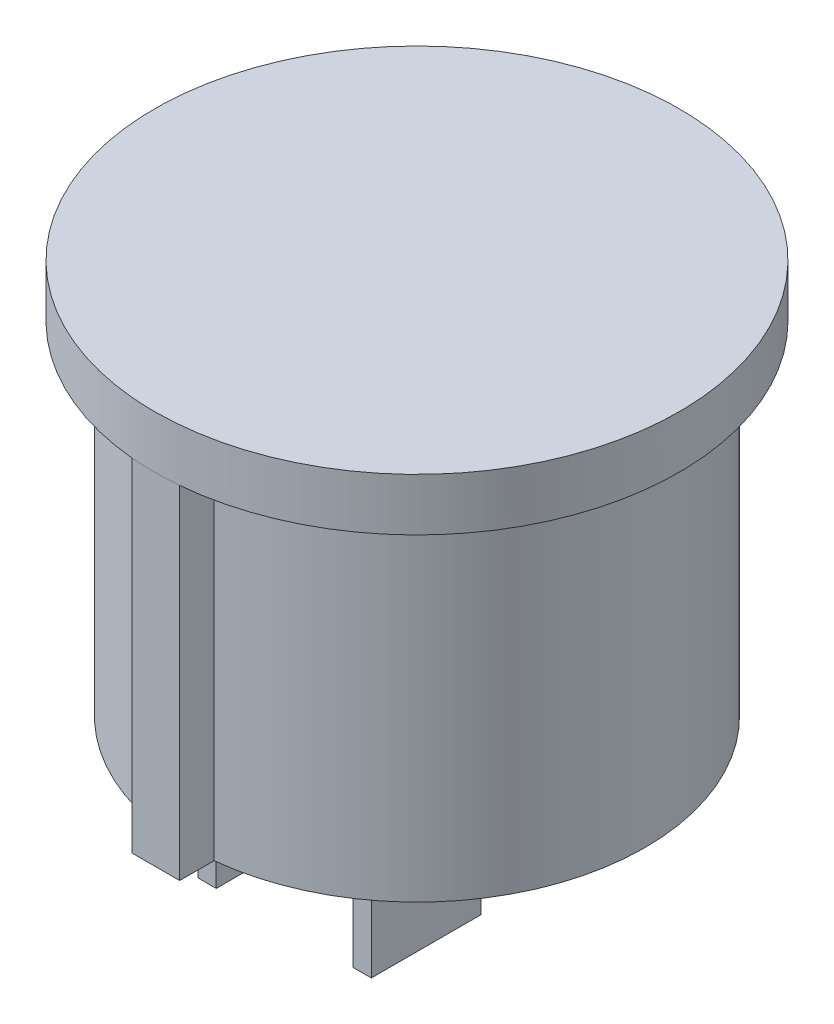
ISO-10303-21;
HEADER;
FILE_DESCRIPTION(('STEP AP214'),'2;1');
FILE_NAME('part.step','',(''),(''),'','','');
FILE_SCHEMA(('AUTOMOTIVE_DESIGN { 1 0 10303 214 1 1 1 1 }'));
ENDSEC;
DATA;
#1=APPLICATION_CONTEXT('core data for automotive mechanical design processes');
#2=APPLICATION_PROTOCOL_DEFINITION('international standard','automotive_design',2000,#1);
#3=PRODUCT_CONTEXT('',#1,'mechanical');
#4=PRODUCT('Part','Part','',(#3));
#5=PRODUCT_RELATED_PRODUCT_CATEGORY('part','',(#4));
#6=PRODUCT_DEFINITION_FORMATION('','',#4);
#7=PRODUCT_DEFINITION_CONTEXT('part definition',#1,'design');
#8=PRODUCT_DEFINITION('design','',#6,#7);
#9=PRODUCT_DEFINITION_SHAPE('','',#8);
#10=(LENGTH_UNIT() NAMED_UNIT(*) SI_UNIT(.MILLI.,.METRE.));
#11=(NAMED_UNIT(*) PLANE_ANGLE_UNIT() SI_UNIT($,.RADIAN.));
#12=(NAMED_UNIT(*) SI_UNIT($,.STERADIAN.) SOLID_ANGLE_UNIT());
#13=UNCERTAINTY_MEASURE_WITH_UNIT(LENGTH_MEASURE(1.E-05),#10,'distance_accuracy_value','');
#14=(GEOMETRIC_REPRESENTATION_CONTEXT(3) GLOBAL_UNCERTAINTY_ASSIGNED_CONTEXT((#13)) GLOBAL_UNIT_ASSIGNED_CONTEXT((#10,
#11,#12)) REPRESENTATION_CONTEXT('',''));
#15=CARTESIAN_POINT('',(0.,0.,0.));
#16=DIRECTION('',(0.,0.,1.));
#17=DIRECTION('',(1.,0.,0.));
#18=AXIS2_PLACEMENT_3D('',#15,#16,#17);
#19=CARTESIAN_POINT('',(0.,15.,0.));
#20=DIRECTION('',(0.,1.,0.));
#21=DIRECTION('',(0.,0.,1.));
#22=AXIS2_PLACEMENT_3D('',#19,#20,#21);
#23=PLANE('',#22);
#24=CARTESIAN_POINT('',(0.,15.,0.));
#25=DIRECTION('',(0.,1.,0.));
#26=DIRECTION('',(0.,0.,1.));
#27=AXIS2_PLACEMENT_3D('',#24,#25,#26);
#28=CIRCLE('',#27,11.5);
#29=CARTESIAN_POINT('',(1.05,15.,11.4519648969074));
#30=VERTEX_POINT('',#29);
#31=CARTESIAN_POINT('',(-1.05,15.,11.4519648969074));
#32=VERTEX_POINT('',#31);
#33=EDGE_CURVE('E150',#30,#32,#28,.T.);
#34=ORIENTED_EDGE('',*,*,#33,.F.);
#35=DIRECTION('',(0.,0.,1.));
#36=VECTOR('',#35,1.);
#37=CARTESIAN_POINT('',(1.05,15.,9.94472221834275));
#38=LINE('',#37,#36);
#39=CARTESIAN_POINT('',(1.05,15.,9.94472221834275));
#40=VERTEX_POINT('',#39);
#41=EDGE_CURVE('E129',#40,#30,#38,.T.);
#42=ORIENTED_EDGE('',*,*,#41,.F.);
#43=CARTESIAN_POINT('',(0.,15.,0.));
#44=DIRECTION('',(0.,1.,0.));
#45=DIRECTION('',(0.,0.,1.));
#46=AXIS2_PLACEMENT_3D('',#43,#44,#45);
#47=CIRCLE('',#46,10.);
#48=CARTESIAN_POINT('',(-1.05,15.,9.94472221834275));
#49=VERTEX_POINT('',#48);
#50=EDGE_CURVE('E11',#40,#49,#47,.T.);
#51=ORIENTED_EDGE('',*,*,#50,.T.);
#52=DIRECTION('',(0.,0.,-1.));
#53=VECTOR('',#52,1.);
#54=CARTESIAN_POINT('',(-1.05,15.,9.94472221834275));
#55=LINE('',#54,#53);
#56=EDGE_CURVE('E154',#32,#49,#55,.T.);
#57=ORIENTED_EDGE('',*,*,#56,.F.);
#58=EDGE_LOOP('',(#34,#42,#51,#57));
#59=FACE_BOUND('',#58,.T.);
#60=ADVANCED_FACE('F35',(#59),#23,.F.);
#61=CARTESIAN_POINT('',(0.,0.,0.));
#62=DIRECTION('',(0.,1.,0.));
#63=DIRECTION('',(0.,0.,1.));
#64=AXIS2_PLACEMENT_3D('',#61,#62,#63);
#65=PLANE('',#64);
#66=DIRECTION('',(0.,0.,1.));
#67=VECTOR('',#66,1.);
#68=CARTESIAN_POINT('',(0.4,0.,-2.4));
#69=LINE('',#68,#67);
#70=CARTESIAN_POINT('',(0.4,0.,-2.4));
#71=VERTEX_POINT('',#70);
#72=CARTESIAN_POINT('',(0.4,0.,2.4));
#73=VERTEX_POINT('',#72);
#74=EDGE_CURVE('E181',#71,#73,#69,.T.);
#75=ORIENTED_EDGE('',*,*,#74,.F.);
#76=DIRECTION('',(1.,0.,0.));
#77=VECTOR('',#76,1.);
#78=CARTESIAN_POINT('',(-0.4,0.,-2.4));
#79=LINE('',#78,#77);
#80=CARTESIAN_POINT('',(-0.4,0.,-2.4));
#81=VERTEX_POINT('',#80);
#82=EDGE_CURVE('E171',#81,#71,#79,.T.);
#83=ORIENTED_EDGE('',*,*,#82,.F.);
#84=DIRECTION('',(0.,0.,-1.));
#85=VECTOR('',#84,1.);
#86=CARTESIAN_POINT('',(-0.4,0.,-2.4));
#87=LINE('',#86,#85);
#88=CARTESIAN_POINT('',(-0.4,0.,2.4));
#89=VERTEX_POINT('',#88);
#90=EDGE_CURVE('E175',#89,#81,#87,.T.);
#91=ORIENTED_EDGE('',*,*,#90,.F.);
#92=DIRECTION('',(-1.,0.,0.));
#93=VECTOR('',#92,1.);
#94=CARTESIAN_POINT('',(-0.4,0.,2.4));
#95=LINE('',#94,#93);
#96=EDGE_CURVE('E178',#73,#89,#95,.T.);
#97=ORIENTED_EDGE('',*,*,#96,.F.);
#98=EDGE_LOOP('',(#75,#83,#91,#97));
#99=FACE_BOUND('',#98,.T.);
#100=CARTESIAN_POINT('',(0.,0.,0.));
#101=DIRECTION('',(0.,1.,0.));
#102=DIRECTION('',(0.,0.,1.));
#103=AXIS2_PLACEMENT_3D('',#100,#101,#102);
#104=CIRCLE('',#103,10.);
#105=CARTESIAN_POINT('',(1.05,0.,9.94472221834275));
#106=VERTEX_POINT('',#105);
#107=CARTESIAN_POINT('',(-1.05,0.,9.94472221834275));
#108=VERTEX_POINT('',#107);
#109=EDGE_CURVE('E39',#106,#108,#104,.T.);
#110=ORIENTED_EDGE('',*,*,#109,.F.);
#111=DIRECTION('',(0.,0.,1.));
#112=VECTOR('',#111,1.);
#113=CARTESIAN_POINT('',(1.05,0.,9.94472221834275));
#114=LINE('',#113,#112);
#115=CARTESIAN_POINT('',(1.05,0.,11.4519648969074));
#116=VERTEX_POINT('',#115);
#117=EDGE_CURVE('E226',#106,#116,#114,.T.);
#118=ORIENTED_EDGE('',*,*,#117,.T.);
#119=DIRECTION('',(-1.,0.,0.));
#120=VECTOR('',#119,1.);
#121=CARTESIAN_POINT('',(-1.05,0.,11.4519648969074));
#122=LINE('',#121,#120);
#123=CARTESIAN_POINT('',(-1.05,0.,11.4519648969074));
#124=VERTEX_POINT('',#123);
#125=EDGE_CURVE('E126',#116,#124,#122,.T.);
#126=ORIENTED_EDGE('',*,*,#125,.T.);
#127=DIRECTION('',(0.,0.,-1.));
#128=VECTOR('',#127,1.);
#129=CARTESIAN_POINT('',(-1.05,0.,9.94472221834275));
#130=LINE('',#129,#128);
#131=EDGE_CURVE('E138',#124,#108,#130,.T.);
#132=ORIENTED_EDGE('',*,*,#131,.T.);
#133=EDGE_LOOP('',(#110,#118,#126,#132));
#134=FACE_BOUND('',#133,.T.);
#135=DIRECTION('',(0.,0.,1.));
#136=VECTOR('',#135,1.);
#137=CARTESIAN_POINT('',(-6.4,0.,-2.4));
#138=LINE('',#137,#136);
#139=CARTESIAN_POINT('',(-6.4,0.,-2.4));
#140=VERTEX_POINT('',#139);
#141=CARTESIAN_POINT('',(-6.4,0.,2.4));
#142=VERTEX_POINT('',#141);
#143=EDGE_CURVE('E211',#140,#142,#138,.T.);
#144=ORIENTED_EDGE('',*,*,#143,.F.);
#145=DIRECTION('',(1.,0.,0.));
#146=VECTOR('',#145,1.);
#147=CARTESIAN_POINT('',(-7.2,0.,-2.4));
#148=LINE('',#147,#146);
#149=CARTESIAN_POINT('',(-7.2,0.,-2.4));
#150=VERTEX_POINT('',#149);
#151=EDGE_CURVE('E203',#150,#140,#148,.T.);
#152=ORIENTED_EDGE('',*,*,#151,.F.);
#153=DIRECTION('',(0.,0.,-1.));
#154=VECTOR('',#153,1.);
#155=CARTESIAN_POINT('',(-7.2,0.,-2.4));
#156=LINE('',#155,#154);
#157=CARTESIAN_POINT('',(-7.2,0.,2.4));
#158=VERTEX_POINT('',#157);
#159=EDGE_CURVE('E207',#158,#150,#156,.T.);
#160=ORIENTED_EDGE('',*,*,#159,.F.);
#161=DIRECTION('',(-1.,0.,0.));
#162=VECTOR('',#161,1.);
#163=CARTESIAN_POINT('',(-7.2,0.,2.4));
#164=LINE('',#163,#162);
#165=EDGE_CURVE('E58',#142,#158,#164,.T.);
#166=ORIENTED_EDGE('',*,*,#165,.F.);
#167=EDGE_LOOP('',(#144,#152,#160,#166));
#168=FACE_BOUND('',#167,.T.);
#169=ADVANCED_FACE('F234',(#99,#134,#168),#65,.F.);
#170=CARTESIAN_POINT('',(0.,15.,0.));
#171=DIRECTION('',(0.,-1.,0.));
#172=DIRECTION('',(0.,0.,-1.));
#173=AXIS2_PLACEMENT_3D('',#170,#171,#172);
#174=CYLINDRICAL_SURFACE('',#173,10.);
#175=ORIENTED_EDGE('',*,*,#50,.F.);
#176=DIRECTION('',(0.,-1.,0.));
#177=VECTOR('',#176,1.);
#178=CARTESIAN_POINT('',(1.05,17.5849140202503,9.94472221834275));
#179=LINE('',#178,#177);
#180=EDGE_CURVE('E134',#40,#106,#179,.T.);
#181=ORIENTED_EDGE('',*,*,#180,.T.);
#182=ORIENTED_EDGE('',*,*,#109,.T.);
#183=DIRECTION('',(0.,-1.,0.));
#184=VECTOR('',#183,1.);
#185=CARTESIAN_POINT('',(-1.05,17.5849140202503,9.94472221834275));
#186=LINE('',#185,#184);
#187=EDGE_CURVE('E221',#49,#108,#186,.T.);
#188=ORIENTED_EDGE('',*,*,#187,.F.);
#189=EDGE_LOOP('',(#175,#181,#182,#188));
#190=FACE_BOUND('',#189,.T.);
#191=ADVANCED_FACE('F37',(#190),#174,.T.);
#192=CARTESIAN_POINT('',(0.,17.3,0.));
#193=DIRECTION('',(0.,-1.,0.));
#194=DIRECTION('',(0.,0.,-1.));
#195=AXIS2_PLACEMENT_3D('',#192,#193,#194);
#196=CYLINDRICAL_SURFACE('',#195,11.5);
#197=CARTESIAN_POINT('',(0.,17.3,0.));
#198=DIRECTION('',(0.,1.,0.));
#199=DIRECTION('',(0.,0.,1.));
#200=AXIS2_PLACEMENT_3D('',#197,#198,#199);
#201=CIRCLE('',#200,11.5);
#202=CARTESIAN_POINT('',(0.,17.3,11.5));
#203=VERTEX_POINT('',#202);
#204=EDGE_CURVE('E155',#203,#203,#201,.T.);
#205=ORIENTED_EDGE('',*,*,#204,.F.);
#206=EDGE_LOOP('',(#205));
#207=FACE_BOUND('',#206,.T.);
#208=ORIENTED_EDGE('',*,*,#33,.T.);
#209=EDGE_CURVE('E144',#32,#30,#28,.T.);
#210=ORIENTED_EDGE('',*,*,#209,.T.);
#211=EDGE_LOOP('',(#208,#210));
#212=FACE_BOUND('',#211,.T.);
#213=ADVANCED_FACE('F149',(#207,#212),#196,.T.);
#214=CARTESIAN_POINT('',(0.,17.3,0.));
#215=DIRECTION('',(0.,1.,0.));
#216=DIRECTION('',(0.,0.,1.));
#217=AXIS2_PLACEMENT_3D('',#214,#215,#216);
#218=PLANE('',#217);
#219=ORIENTED_EDGE('',*,*,#204,.T.);
#220=EDGE_LOOP('',(#219));
#221=FACE_BOUND('',#220,.T.);
#222=ADVANCED_FACE('F255',(#221),#218,.T.);
#223=ORIENTED_EDGE('',*,*,#209,.F.);
#224=DIRECTION('',(-1.,0.,0.));
#225=VECTOR('',#224,1.);
#226=CARTESIAN_POINT('',(-1.05,15.,11.4519648969074));
#227=LINE('',#226,#225);
#228=EDGE_CURVE('E50',#30,#32,#227,.T.);
#229=ORIENTED_EDGE('',*,*,#228,.F.);
#230=EDGE_LOOP('',(#223,#229));
#231=FACE_BOUND('',#230,.T.);
#232=ADVANCED_FACE('F143',(#231),#23,.F.);
#233=CARTESIAN_POINT('',(0.4,-8.55,-2.4));
#234=DIRECTION('',(-1.,0.,0.));
#235=DIRECTION('',(0.,0.,1.));
#236=AXIS2_PLACEMENT_3D('',#233,#234,#235);
#237=PLANE('',#236);
#238=ORIENTED_EDGE('',*,*,#74,.T.);
#239=DIRECTION('',(0.,1.,0.));
#240=VECTOR('',#239,1.);
#241=CARTESIAN_POINT('',(0.4,-8.55,2.4));
#242=LINE('',#241,#240);
#243=CARTESIAN_POINT('',(0.4,-8.55,2.4));
#244=VERTEX_POINT('',#243);
#245=EDGE_CURVE('E151',#244,#73,#242,.T.);
#246=ORIENTED_EDGE('',*,*,#245,.F.);
#247=DIRECTION('',(0.,0.,1.));
#248=VECTOR('',#247,1.);
#249=CARTESIAN_POINT('',(0.4,-8.55,-2.4));
#250=LINE('',#249,#248);
#251=CARTESIAN_POINT('',(0.4,-8.55,-2.4));
#252=VERTEX_POINT('',#251);
#253=EDGE_CURVE('E174',#252,#244,#250,.T.);
#254=ORIENTED_EDGE('',*,*,#253,.F.);
#255=DIRECTION('',(0.,1.,0.));
#256=VECTOR('',#255,1.);
#257=CARTESIAN_POINT('',(0.4,-8.55,-2.4));
#258=LINE('',#257,#256);
#259=EDGE_CURVE('E167',#252,#71,#258,.T.);
#260=ORIENTED_EDGE('',*,*,#259,.T.);
#261=EDGE_LOOP('',(#238,#246,#254,#260));
#262=FACE_BOUND('',#261,.T.);
#263=ADVANCED_FACE('F254',(#262),#237,.F.);
#264=CARTESIAN_POINT('',(-0.4,-8.55,2.4));
#265=DIRECTION('',(0.,0.,-1.));
#266=DIRECTION('',(-1.,0.,0.));
#267=AXIS2_PLACEMENT_3D('',#264,#265,#266);
#268=PLANE('',#267);
#269=ORIENTED_EDGE('',*,*,#96,.T.);
#270=DIRECTION('',(0.,1.,0.));
#271=VECTOR('',#270,1.);
#272=CARTESIAN_POINT('',(-0.4,-8.55,2.4));
#273=LINE('',#272,#271);
#274=CARTESIAN_POINT('',(-0.4,-8.55,2.4));
#275=VERTEX_POINT('',#274);
#276=EDGE_CURVE('E161',#275,#89,#273,.T.);
#277=ORIENTED_EDGE('',*,*,#276,.F.);
#278=DIRECTION('',(-1.,0.,0.));
#279=VECTOR('',#278,1.);
#280=CARTESIAN_POINT('',(-0.4,-8.55,2.4));
#281=LINE('',#280,#279);
#282=EDGE_CURVE('E188',#244,#275,#281,.T.);
#283=ORIENTED_EDGE('',*,*,#282,.F.);
#284=ORIENTED_EDGE('',*,*,#245,.T.);
#285=EDGE_LOOP('',(#269,#277,#283,#284));
#286=FACE_BOUND('',#285,.T.);
#287=ADVANCED_FACE('F260',(#286),#268,.F.);
#288=CARTESIAN_POINT('',(-0.4,-8.55,-2.4));
#289=DIRECTION('',(1.,0.,0.));
#290=DIRECTION('',(0.,0.,-1.));
#291=AXIS2_PLACEMENT_3D('',#288,#289,#290);
#292=PLANE('',#291);
#293=ORIENTED_EDGE('',*,*,#90,.T.);
#294=DIRECTION('',(0.,1.,0.));
#295=VECTOR('',#294,1.);
#296=CARTESIAN_POINT('',(-0.4,-8.55,-2.4));
#297=LINE('',#296,#295);
#298=CARTESIAN_POINT('',(-0.4,-8.55,-2.4));
#299=VERTEX_POINT('',#298);
#300=EDGE_CURVE('E164',#299,#81,#297,.T.);
#301=ORIENTED_EDGE('',*,*,#300,.F.);
#302=DIRECTION('',(0.,0.,-1.));
#303=VECTOR('',#302,1.);
#304=CARTESIAN_POINT('',(-0.4,-8.55,-2.4));
#305=LINE('',#304,#303);
#306=EDGE_CURVE('E186',#275,#299,#305,.T.);
#307=ORIENTED_EDGE('',*,*,#306,.F.);
#308=ORIENTED_EDGE('',*,*,#276,.T.);
#309=EDGE_LOOP('',(#293,#301,#307,#308));
#310=FACE_BOUND('',#309,.T.);
#311=ADVANCED_FACE('F271',(#310),#292,.F.);
#312=CARTESIAN_POINT('',(-0.4,-8.55,-2.4));
#313=DIRECTION('',(0.,0.,1.));
#314=DIRECTION('',(1.,0.,0.));
#315=AXIS2_PLACEMENT_3D('',#312,#313,#314);
#316=PLANE('',#315);
#317=ORIENTED_EDGE('',*,*,#82,.T.);
#318=ORIENTED_EDGE('',*,*,#259,.F.);
#319=DIRECTION('',(1.,0.,0.));
#320=VECTOR('',#319,1.);
#321=CARTESIAN_POINT('',(-0.4,-8.55,-2.4));
#322=LINE('',#321,#320);
#323=EDGE_CURVE('E170',#299,#252,#322,.T.);
#324=ORIENTED_EDGE('',*,*,#323,.F.);
#325=ORIENTED_EDGE('',*,*,#300,.T.);
#326=EDGE_LOOP('',(#317,#318,#324,#325));
#327=FACE_BOUND('',#326,.T.);
#328=ADVANCED_FACE('F275',(#327),#316,.F.);
#329=CARTESIAN_POINT('',(0.,-8.55,0.));
#330=DIRECTION('',(0.,1.,0.));
#331=DIRECTION('',(0.,0.,1.));
#332=AXIS2_PLACEMENT_3D('',#329,#330,#331);
#333=PLANE('',#332);
#334=ORIENTED_EDGE('',*,*,#253,.T.);
#335=ORIENTED_EDGE('',*,*,#282,.T.);
#336=ORIENTED_EDGE('',*,*,#306,.T.);
#337=ORIENTED_EDGE('',*,*,#323,.T.);
#338=EDGE_LOOP('',(#334,#335,#336,#337));
#339=FACE_BOUND('',#338,.T.);
#340=ADVANCED_FACE('F279',(#339),#333,.F.);
#341=CARTESIAN_POINT('',(-6.4,-8.55,-2.4));
#342=DIRECTION('',(-1.,0.,0.));
#343=DIRECTION('',(0.,0.,1.));
#344=AXIS2_PLACEMENT_3D('',#341,#342,#343);
#345=PLANE('',#344);
#346=ORIENTED_EDGE('',*,*,#143,.T.);
#347=DIRECTION('',(0.,1.,0.));
#348=VECTOR('',#347,1.);
#349=CARTESIAN_POINT('',(-6.4,-8.55,2.4));
#350=LINE('',#349,#348);
#351=CARTESIAN_POINT('',(-6.4,-8.55,2.4));
#352=VERTEX_POINT('',#351);
#353=EDGE_CURVE('E184',#352,#142,#350,.T.);
#354=ORIENTED_EDGE('',*,*,#353,.F.);
#355=DIRECTION('',(0.,0.,1.));
#356=VECTOR('',#355,1.);
#357=CARTESIAN_POINT('',(-6.4,-8.55,-2.4));
#358=LINE('',#357,#356);
#359=CARTESIAN_POINT('',(-6.4,-8.55,-2.4));
#360=VERTEX_POINT('',#359);
#361=EDGE_CURVE('E206',#360,#352,#358,.T.);
#362=ORIENTED_EDGE('',*,*,#361,.F.);
#363=DIRECTION('',(0.,1.,0.));
#364=VECTOR('',#363,1.);
#365=CARTESIAN_POINT('',(-6.4,-8.55,-2.4));
#366=LINE('',#365,#364);
#367=EDGE_CURVE('E199',#360,#140,#366,.T.);
#368=ORIENTED_EDGE('',*,*,#367,.T.);
#369=EDGE_LOOP('',(#346,#354,#362,#368));
#370=FACE_BOUND('',#369,.T.);
#371=ADVANCED_FACE('F283',(#370),#345,.F.);
#372=CARTESIAN_POINT('',(-7.2,-8.55,2.4));
#373=DIRECTION('',(0.,0.,-1.));
#374=DIRECTION('',(-1.,0.,0.));
#375=AXIS2_PLACEMENT_3D('',#372,#373,#374);
#376=PLANE('',#375);
#377=ORIENTED_EDGE('',*,*,#165,.T.);
#378=DIRECTION('',(0.,1.,0.));
#379=VECTOR('',#378,1.);
#380=CARTESIAN_POINT('',(-7.2,-8.55,2.4));
#381=LINE('',#380,#379);
#382=CARTESIAN_POINT('',(-7.2,-8.55,2.4));
#383=VERTEX_POINT('',#382);
#384=EDGE_CURVE('E193',#383,#158,#381,.T.);
#385=ORIENTED_EDGE('',*,*,#384,.F.);
#386=DIRECTION('',(-1.,0.,0.));
#387=VECTOR('',#386,1.);
#388=CARTESIAN_POINT('',(-7.2,-8.55,2.4));
#389=LINE('',#388,#387);
#390=EDGE_CURVE('E217',#352,#383,#389,.T.);
#391=ORIENTED_EDGE('',*,*,#390,.F.);
#392=ORIENTED_EDGE('',*,*,#353,.T.);
#393=EDGE_LOOP('',(#377,#385,#391,#392));
#394=FACE_BOUND('',#393,.T.);
#395=ADVANCED_FACE('F287',(#394),#376,.F.);
#396=CARTESIAN_POINT('',(-7.2,-8.55,-2.4));
#397=DIRECTION('',(1.,0.,0.));
#398=DIRECTION('',(0.,0.,-1.));
#399=AXIS2_PLACEMENT_3D('',#396,#397,#398);
#400=PLANE('',#399);
#401=ORIENTED_EDGE('',*,*,#159,.T.);
#402=DIRECTION('',(0.,1.,0.));
#403=VECTOR('',#402,1.);
#404=CARTESIAN_POINT('',(-7.2,-8.55,-2.4));
#405=LINE('',#404,#403);
#406=CARTESIAN_POINT('',(-7.2,-8.55,-2.4));
#407=VERTEX_POINT('',#406);
#408=EDGE_CURVE('E196',#407,#150,#405,.T.);
#409=ORIENTED_EDGE('',*,*,#408,.F.);
#410=DIRECTION('',(0.,0.,-1.));
#411=VECTOR('',#410,1.);
#412=CARTESIAN_POINT('',(-7.2,-8.55,-2.4));
#413=LINE('',#412,#411);
#414=EDGE_CURVE('E215',#383,#407,#413,.T.);
#415=ORIENTED_EDGE('',*,*,#414,.F.);
#416=ORIENTED_EDGE('',*,*,#384,.T.);
#417=EDGE_LOOP('',(#401,#409,#415,#416));
#418=FACE_BOUND('',#417,.T.);
#419=ADVANCED_FACE('F291',(#418),#400,.F.);
#420=CARTESIAN_POINT('',(-7.2,-8.55,-2.4));
#421=DIRECTION('',(0.,0.,1.));
#422=DIRECTION('',(1.,0.,0.));
#423=AXIS2_PLACEMENT_3D('',#420,#421,#422);
#424=PLANE('',#423);
#425=ORIENTED_EDGE('',*,*,#151,.T.);
#426=ORIENTED_EDGE('',*,*,#367,.F.);
#427=DIRECTION('',(1.,0.,0.));
#428=VECTOR('',#427,1.);
#429=CARTESIAN_POINT('',(-7.2,-8.55,-2.4));
#430=LINE('',#429,#428);
#431=EDGE_CURVE('E202',#407,#360,#430,.T.);
#432=ORIENTED_EDGE('',*,*,#431,.F.);
#433=ORIENTED_EDGE('',*,*,#408,.T.);
#434=EDGE_LOOP('',(#425,#426,#432,#433));
#435=FACE_BOUND('',#434,.T.);
#436=ADVANCED_FACE('F295',(#435),#424,.F.);
#437=CARTESIAN_POINT('',(0.,-8.55,0.));
#438=DIRECTION('',(0.,1.,0.));
#439=DIRECTION('',(0.,0.,1.));
#440=AXIS2_PLACEMENT_3D('',#437,#438,#439);
#441=PLANE('',#440);
#442=ORIENTED_EDGE('',*,*,#361,.T.);
#443=ORIENTED_EDGE('',*,*,#390,.T.);
#444=ORIENTED_EDGE('',*,*,#414,.T.);
#445=ORIENTED_EDGE('',*,*,#431,.T.);
#446=EDGE_LOOP('',(#442,#443,#444,#445));
#447=FACE_BOUND('',#446,.T.);
#448=ADVANCED_FACE('F299',(#447),#441,.F.);
#449=CARTESIAN_POINT('',(1.05,17.5849140202503,9.94472221834275));
#450=DIRECTION('',(1.,0.,0.));
#451=DIRECTION('',(0.,0.,-1.));
#452=AXIS2_PLACEMENT_3D('',#449,#450,#451);
#453=PLANE('',#452);
#454=ORIENTED_EDGE('',*,*,#180,.F.);
#455=ORIENTED_EDGE('',*,*,#41,.T.);
#456=DIRECTION('',(0.,-1.,0.));
#457=VECTOR('',#456,1.);
#458=CARTESIAN_POINT('',(1.05,17.5849140202503,11.4519648969074));
#459=LINE('',#458,#457);
#460=EDGE_CURVE('E122',#30,#116,#459,.T.);
#461=ORIENTED_EDGE('',*,*,#460,.T.);
#462=ORIENTED_EDGE('',*,*,#117,.F.);
#463=EDGE_LOOP('',(#454,#455,#461,#462));
#464=FACE_BOUND('',#463,.T.);
#465=ADVANCED_FACE('F132',(#464),#453,.T.);
#466=CARTESIAN_POINT('',(-1.05,17.5849140202503,11.4519648969074));
#467=DIRECTION('',(0.,0.,1.));
#468=DIRECTION('',(1.,0.,0.));
#469=AXIS2_PLACEMENT_3D('',#466,#467,#468);
#470=PLANE('',#469);
#471=ORIENTED_EDGE('',*,*,#460,.F.);
#472=ORIENTED_EDGE('',*,*,#228,.T.);
#473=DIRECTION('',(0.,-1.,0.));
#474=VECTOR('',#473,1.);
#475=CARTESIAN_POINT('',(-1.05,17.5849140202503,11.4519648969074));
#476=LINE('',#475,#474);
#477=EDGE_CURVE('E146',#32,#124,#476,.T.);
#478=ORIENTED_EDGE('',*,*,#477,.T.);
#479=ORIENTED_EDGE('',*,*,#125,.F.);
#480=EDGE_LOOP('',(#471,#472,#478,#479));
#481=FACE_BOUND('',#480,.T.);
#482=ADVANCED_FACE('F124',(#481),#470,.T.);
#483=CARTESIAN_POINT('',(-1.05,17.5849140202503,9.94472221834275));
#484=DIRECTION('',(-1.,0.,0.));
#485=DIRECTION('',(0.,0.,1.));
#486=AXIS2_PLACEMENT_3D('',#483,#484,#485);
#487=PLANE('',#486);
#488=ORIENTED_EDGE('',*,*,#477,.F.);
#489=ORIENTED_EDGE('',*,*,#56,.T.);
#490=ORIENTED_EDGE('',*,*,#187,.T.);
#491=ORIENTED_EDGE('',*,*,#131,.F.);
#492=EDGE_LOOP('',(#488,#489,#490,#491));
#493=FACE_BOUND('',#492,.T.);
#494=ADVANCED_FACE('F238',(#493),#487,.T.);
#495=CLOSED_SHELL('',(#60,#169,#191,#213,#222,#232,#263,#287,#311,#328,#340,#371,#395,#419,#436,
#448,#465,#482,#494));
#496=MANIFOLD_SOLID_BREP('B2',#495);
#497=ADVANCED_BREP_SHAPE_REPRESENTATION('',(#18,#496),#14);
#498=SHAPE_DEFINITION_REPRESENTATION(#9,#497);
ENDSEC;
END-ISO-10303-21;
